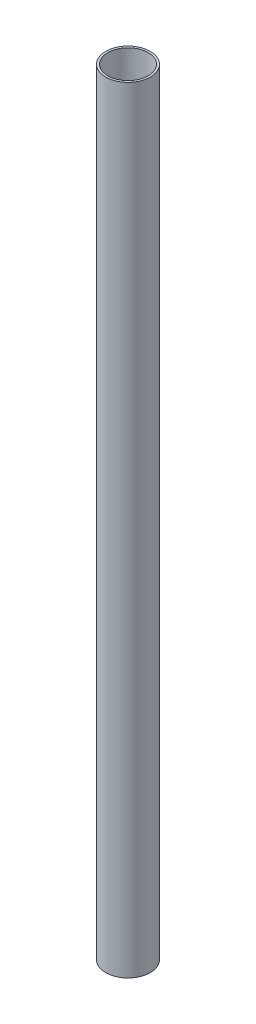
ISO-10303-21;
HEADER;
FILE_DESCRIPTION(('STEP AP214'),'2;1');
FILE_NAME('part.step','',(''),(''),'','','');
FILE_SCHEMA(('AUTOMOTIVE_DESIGN { 1 0 10303 214 1 1 1 1 }'));
ENDSEC;
DATA;
#1=APPLICATION_CONTEXT('core data for automotive mechanical design processes');
#2=APPLICATION_PROTOCOL_DEFINITION('international standard','automotive_design',2000,#1);
#3=PRODUCT_CONTEXT('',#1,'mechanical');
#4=PRODUCT('Part','Part','',(#3));
#5=PRODUCT_RELATED_PRODUCT_CATEGORY('part','',(#4));
#6=PRODUCT_DEFINITION_FORMATION('','',#4);
#7=PRODUCT_DEFINITION_CONTEXT('part definition',#1,'design');
#8=PRODUCT_DEFINITION('design','',#6,#7);
#9=PRODUCT_DEFINITION_SHAPE('','',#8);
#10=(LENGTH_UNIT() NAMED_UNIT(*) SI_UNIT(.MILLI.,.METRE.));
#11=(NAMED_UNIT(*) PLANE_ANGLE_UNIT() SI_UNIT($,.RADIAN.));
#12=(NAMED_UNIT(*) SI_UNIT($,.STERADIAN.) SOLID_ANGLE_UNIT());
#13=UNCERTAINTY_MEASURE_WITH_UNIT(LENGTH_MEASURE(1.E-05),#10,'distance_accuracy_value','');
#14=(GEOMETRIC_REPRESENTATION_CONTEXT(3) GLOBAL_UNCERTAINTY_ASSIGNED_CONTEXT((#13)) GLOBAL_UNIT_ASSIGNED_CONTEXT((#10,
#11,#12)) REPRESENTATION_CONTEXT('',''));
#15=CARTESIAN_POINT('',(0.,0.,0.));
#16=DIRECTION('',(0.,0.,1.));
#17=DIRECTION('',(1.,0.,0.));
#18=AXIS2_PLACEMENT_3D('',#15,#16,#17);
#19=CARTESIAN_POINT('',(0.,552.45,0.));
#20=DIRECTION('',(0.,1.,0.));
#21=DIRECTION('',(0.,0.,1.));
#22=AXIS2_PLACEMENT_3D('',#19,#20,#21);
#23=PLANE('',#22);
#24=CARTESIAN_POINT('',(0.,552.45,0.));
#25=DIRECTION('',(0.,1.,0.));
#26=DIRECTION('',(0.,0.,1.));
#27=AXIS2_PLACEMENT_3D('',#24,#25,#26);
#28=CIRCLE('',#27,15.875);
#29=CARTESIAN_POINT('',(0.,552.45,15.875));
#30=VERTEX_POINT('',#29);
#31=EDGE_CURVE('E11',#30,#30,#28,.T.);
#32=ORIENTED_EDGE('',*,*,#31,.T.);
#33=EDGE_LOOP('',(#32));
#34=FACE_BOUND('',#33,.T.);
#35=CARTESIAN_POINT('',(0.,552.45,0.));
#36=DIRECTION('',(0.,1.,0.));
#37=DIRECTION('',(0.,0.,1.));
#38=AXIS2_PLACEMENT_3D('',#35,#36,#37);
#39=CIRCLE('',#38,14.351);
#40=CARTESIAN_POINT('',(0.,552.45,14.351));
#41=VERTEX_POINT('',#40);
#42=EDGE_CURVE('E54',#41,#41,#39,.T.);
#43=ORIENTED_EDGE('',*,*,#42,.F.);
#44=EDGE_LOOP('',(#43));
#45=FACE_BOUND('',#44,.T.);
#46=ADVANCED_FACE('F40',(#34,#45),#23,.T.);
#47=CARTESIAN_POINT('',(0.,0.,0.));
#48=DIRECTION('',(0.,1.,0.));
#49=DIRECTION('',(0.,0.,1.));
#50=AXIS2_PLACEMENT_3D('',#47,#48,#49);
#51=PLANE('',#50);
#52=CARTESIAN_POINT('',(0.,0.,0.));
#53=DIRECTION('',(0.,1.,0.));
#54=DIRECTION('',(0.,0.,1.));
#55=AXIS2_PLACEMENT_3D('',#52,#53,#54);
#56=CIRCLE('',#55,15.875);
#57=CARTESIAN_POINT('',(0.,0.,15.875));
#58=VERTEX_POINT('',#57);
#59=EDGE_CURVE('E44',#58,#58,#56,.T.);
#60=ORIENTED_EDGE('',*,*,#59,.F.);
#61=EDGE_LOOP('',(#60));
#62=FACE_BOUND('',#61,.T.);
#63=CARTESIAN_POINT('',(0.,0.,0.));
#64=DIRECTION('',(0.,1.,0.));
#65=DIRECTION('',(0.,0.,1.));
#66=AXIS2_PLACEMENT_3D('',#63,#64,#65);
#67=CIRCLE('',#66,14.351);
#68=CARTESIAN_POINT('',(0.,0.,14.351));
#69=VERTEX_POINT('',#68);
#70=EDGE_CURVE('E56',#69,#69,#67,.T.);
#71=ORIENTED_EDGE('',*,*,#70,.T.);
#72=EDGE_LOOP('',(#71));
#73=FACE_BOUND('',#72,.T.);
#74=ADVANCED_FACE('F67',(#62,#73),#51,.F.);
#75=CARTESIAN_POINT('',(0.,552.45,0.));
#76=DIRECTION('',(0.,-1.,0.));
#77=DIRECTION('',(0.,0.,-1.));
#78=AXIS2_PLACEMENT_3D('',#75,#76,#77);
#79=CYLINDRICAL_SURFACE('',#78,15.875);
#80=ORIENTED_EDGE('',*,*,#31,.F.);
#81=EDGE_LOOP('',(#80));
#82=FACE_BOUND('',#81,.T.);
#83=ORIENTED_EDGE('',*,*,#59,.T.);
#84=EDGE_LOOP('',(#83));
#85=FACE_BOUND('',#84,.T.);
#86=ADVANCED_FACE('F42',(#82,#85),#79,.T.);
#87=CARTESIAN_POINT('',(0.,552.45,0.));
#88=DIRECTION('',(0.,-1.,0.));
#89=DIRECTION('',(0.,0.,-1.));
#90=AXIS2_PLACEMENT_3D('',#87,#88,#89);
#91=CYLINDRICAL_SURFACE('',#90,14.351);
#92=ORIENTED_EDGE('',*,*,#42,.T.);
#93=EDGE_LOOP('',(#92));
#94=FACE_BOUND('',#93,.T.);
#95=ORIENTED_EDGE('',*,*,#70,.F.);
#96=EDGE_LOOP('',(#95));
#97=FACE_BOUND('',#96,.T.);
#98=ADVANCED_FACE('F63',(#94,#97),#91,.F.);
#99=CLOSED_SHELL('',(#46,#74,#86,#98));
#100=MANIFOLD_SOLID_BREP('B2',#99);
#101=ADVANCED_BREP_SHAPE_REPRESENTATION('',(#18,#100),#14);
#102=SHAPE_DEFINITION_REPRESENTATION(#9,#101);
ENDSEC;
END-ISO-10303-21;
